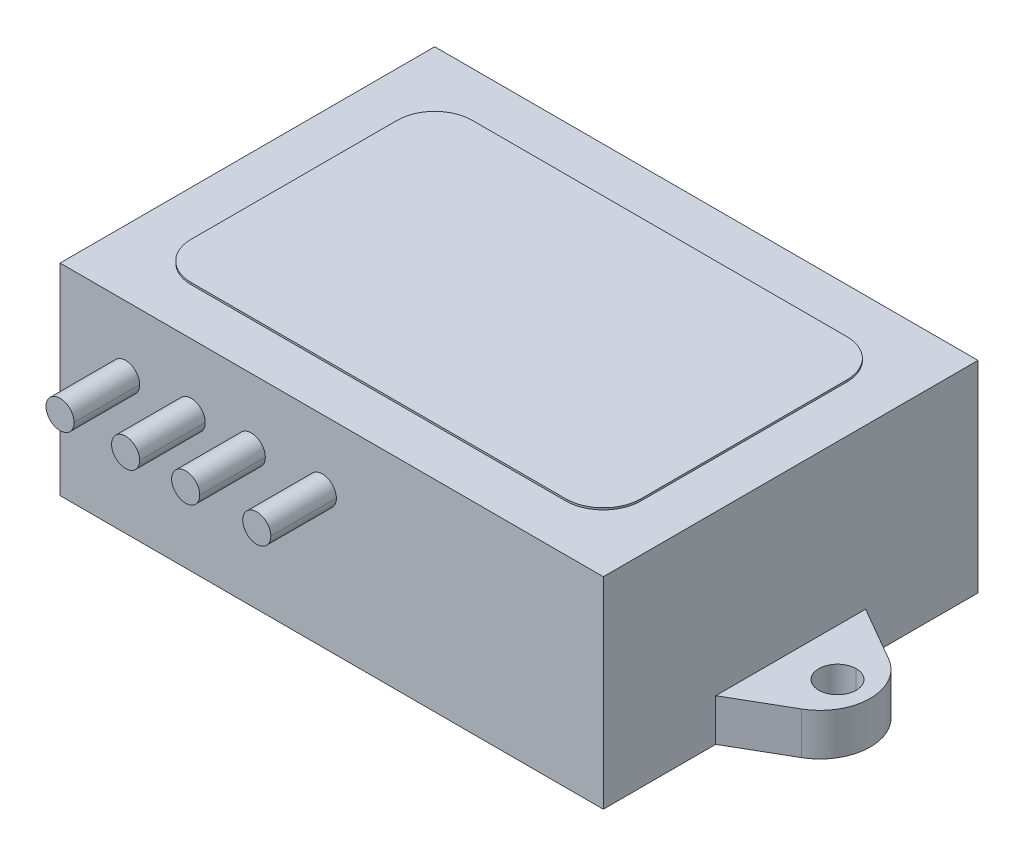
ISO-10303-21;
HEADER;
FILE_DESCRIPTION(('STEP AP214'),'2;1');
FILE_NAME('part.step','',(''),(''),'','','');
FILE_SCHEMA(('AUTOMOTIVE_DESIGN { 1 0 10303 214 1 1 1 1 }'));
ENDSEC;
DATA;
#1=APPLICATION_CONTEXT('core data for automotive mechanical design processes');
#2=APPLICATION_PROTOCOL_DEFINITION('international standard','automotive_design',2000,#1);
#3=PRODUCT_CONTEXT('',#1,'mechanical');
#4=PRODUCT('Part','Part','',(#3));
#5=PRODUCT_RELATED_PRODUCT_CATEGORY('part','',(#4));
#6=PRODUCT_DEFINITION_FORMATION('','',#4);
#7=PRODUCT_DEFINITION_CONTEXT('part definition',#1,'design');
#8=PRODUCT_DEFINITION('design','',#6,#7);
#9=PRODUCT_DEFINITION_SHAPE('','',#8);
#10=(LENGTH_UNIT() NAMED_UNIT(*) SI_UNIT(.MILLI.,.METRE.));
#11=(NAMED_UNIT(*) PLANE_ANGLE_UNIT() SI_UNIT($,.RADIAN.));
#12=(NAMED_UNIT(*) SI_UNIT($,.STERADIAN.) SOLID_ANGLE_UNIT());
#13=UNCERTAINTY_MEASURE_WITH_UNIT(LENGTH_MEASURE(1.E-05),#10,'distance_accuracy_value','');
#14=(GEOMETRIC_REPRESENTATION_CONTEXT(3) GLOBAL_UNCERTAINTY_ASSIGNED_CONTEXT((#13)) GLOBAL_UNIT_ASSIGNED_CONTEXT((#10,
#11,#12)) REPRESENTATION_CONTEXT('',''));
#15=CARTESIAN_POINT('',(0.,0.,0.));
#16=DIRECTION('',(0.,0.,1.));
#17=DIRECTION('',(1.,0.,0.));
#18=AXIS2_PLACEMENT_3D('',#15,#16,#17);
#19=CARTESIAN_POINT('',(20.4126967231264,14.5,7.));
#20=DIRECTION('',(0.,0.,1.));
#21=DIRECTION('',(1.,0.,0.));
#22=AXIS2_PLACEMENT_3D('',#19,#20,#21);
#23=PLANE('',#22);
#24=CARTESIAN_POINT('',(20.4126967231264,14.5,7.));
#25=DIRECTION('',(0.,0.,1.));
#26=DIRECTION('',(1.,0.,0.));
#27=AXIS2_PLACEMENT_3D('',#24,#25,#26);
#28=CIRCLE('',#27,1.5);
#29=CARTESIAN_POINT('',(18.9126967231264,14.5,7.));
#30=VERTEX_POINT('',#29);
#31=CARTESIAN_POINT('',(21.9126967231264,14.5,7.));
#32=VERTEX_POINT('',#31);
#33=EDGE_CURVE('E11',#30,#32,#28,.T.);
#34=ORIENTED_EDGE('',*,*,#33,.T.);
#35=CARTESIAN_POINT('',(20.4126967231264,14.5,7.));
#36=DIRECTION('',(0.,0.,1.));
#37=DIRECTION('',(1.,0.,0.));
#38=AXIS2_PLACEMENT_3D('',#35,#36,#37);
#39=CIRCLE('',#38,1.5);
#40=EDGE_CURVE('E671',#32,#30,#39,.T.);
#41=ORIENTED_EDGE('',*,*,#40,.T.);
#42=EDGE_LOOP('',(#34,#41));
#43=FACE_BOUND('',#42,.T.);
#44=ADVANCED_FACE('F16',(#43),#23,.T.);
#45=CARTESIAN_POINT('',(20.4126967231264,14.5,7.));
#46=DIRECTION('',(0.,0.,-1.));
#47=DIRECTION('',(-1.,0.,0.));
#48=AXIS2_PLACEMENT_3D('',#45,#46,#47);
#49=CYLINDRICAL_SURFACE('',#48,1.5);
#50=DIRECTION('',(0.,0.,-1.));
#51=VECTOR('',#50,1.);
#52=CARTESIAN_POINT('',(21.9126967231264,14.5,7.));
#53=LINE('',#52,#51);
#54=CARTESIAN_POINT('',(21.9126967231264,14.5,0.));
#55=VERTEX_POINT('',#54);
#56=EDGE_CURVE('E674',#32,#55,#53,.T.);
#57=ORIENTED_EDGE('',*,*,#56,.F.);
#58=ORIENTED_EDGE('',*,*,#33,.F.);
#59=DIRECTION('',(0.,0.,-1.));
#60=VECTOR('',#59,1.);
#61=CARTESIAN_POINT('',(18.9126967231264,14.5,7.));
#62=LINE('',#61,#60);
#63=CARTESIAN_POINT('',(18.9126967231264,14.5,0.));
#64=VERTEX_POINT('',#63);
#65=EDGE_CURVE('E344',#30,#64,#62,.T.);
#66=ORIENTED_EDGE('',*,*,#65,.T.);
#67=CARTESIAN_POINT('',(20.4126967231264,14.5,0.));
#68=DIRECTION('',(0.,0.,1.));
#69=DIRECTION('',(-1.,0.,0.));
#70=AXIS2_PLACEMENT_3D('',#67,#68,#69);
#71=CIRCLE('',#70,1.5);
#72=EDGE_CURVE('E435',#64,#55,#71,.T.);
#73=ORIENTED_EDGE('',*,*,#72,.T.);
#74=EDGE_LOOP('',(#57,#58,#66,#73));
#75=FACE_BOUND('',#74,.T.);
#76=ADVANCED_FACE('F662',(#75),#49,.T.);
#77=CARTESIAN_POINT('',(14.,14.5,7.));
#78=DIRECTION('',(0.,0.,1.));
#79=DIRECTION('',(1.,0.,0.));
#80=AXIS2_PLACEMENT_3D('',#77,#78,#79);
#81=PLANE('',#80);
#82=CARTESIAN_POINT('',(14.,14.5,7.));
#83=DIRECTION('',(0.,0.,1.));
#84=DIRECTION('',(1.,0.,0.));
#85=AXIS2_PLACEMENT_3D('',#82,#83,#84);
#86=CIRCLE('',#85,1.5);
#87=CARTESIAN_POINT('',(12.5,14.5,7.));
#88=VERTEX_POINT('',#87);
#89=CARTESIAN_POINT('',(15.5,14.5,7.));
#90=VERTEX_POINT('',#89);
#91=EDGE_CURVE('E19',#88,#90,#86,.T.);
#92=ORIENTED_EDGE('',*,*,#91,.T.);
#93=CARTESIAN_POINT('',(14.,14.5,7.));
#94=DIRECTION('',(0.,0.,1.));
#95=DIRECTION('',(1.,0.,0.));
#96=AXIS2_PLACEMENT_3D('',#93,#94,#95);
#97=CIRCLE('',#96,1.5);
#98=EDGE_CURVE('E340',#90,#88,#97,.T.);
#99=ORIENTED_EDGE('',*,*,#98,.T.);
#100=EDGE_LOOP('',(#92,#99));
#101=FACE_BOUND('',#100,.T.);
#102=ADVANCED_FACE('F666',(#101),#81,.T.);
#103=CARTESIAN_POINT('',(14.,14.5,7.));
#104=DIRECTION('',(0.,0.,-1.));
#105=DIRECTION('',(-1.,0.,0.));
#106=AXIS2_PLACEMENT_3D('',#103,#104,#105);
#107=CYLINDRICAL_SURFACE('',#106,1.5);
#108=DIRECTION('',(0.,0.,-1.));
#109=VECTOR('',#108,1.);
#110=CARTESIAN_POINT('',(15.5,14.5,7.));
#111=LINE('',#110,#109);
#112=CARTESIAN_POINT('',(15.5,14.5,0.));
#113=VERTEX_POINT('',#112);
#114=EDGE_CURVE('E342',#90,#113,#111,.T.);
#115=ORIENTED_EDGE('',*,*,#114,.F.);
#116=ORIENTED_EDGE('',*,*,#91,.F.);
#117=DIRECTION('',(0.,0.,-1.));
#118=VECTOR('',#117,1.);
#119=CARTESIAN_POINT('',(12.5,14.5,7.));
#120=LINE('',#119,#118);
#121=CARTESIAN_POINT('',(12.5,14.5,0.));
#122=VERTEX_POINT('',#121);
#123=EDGE_CURVE('E360',#88,#122,#120,.T.);
#124=ORIENTED_EDGE('',*,*,#123,.T.);
#125=CARTESIAN_POINT('',(14.,14.5,0.));
#126=DIRECTION('',(0.,0.,1.));
#127=DIRECTION('',(-1.,0.,0.));
#128=AXIS2_PLACEMENT_3D('',#125,#126,#127);
#129=CIRCLE('',#128,1.5);
#130=EDGE_CURVE('E306',#122,#113,#129,.T.);
#131=ORIENTED_EDGE('',*,*,#130,.T.);
#132=EDGE_LOOP('',(#115,#116,#124,#131));
#133=FACE_BOUND('',#132,.T.);
#134=ADVANCED_FACE('F1489',(#133),#107,.T.);
#135=CARTESIAN_POINT('',(28.,14.5,7.));
#136=DIRECTION('',(0.,0.,1.));
#137=DIRECTION('',(1.,0.,0.));
#138=AXIS2_PLACEMENT_3D('',#135,#136,#137);
#139=PLANE('',#138);
#140=CARTESIAN_POINT('',(28.,14.5,7.));
#141=DIRECTION('',(0.,0.,1.));
#142=DIRECTION('',(1.,0.,0.));
#143=AXIS2_PLACEMENT_3D('',#140,#141,#142);
#144=CIRCLE('',#143,1.5);
#145=CARTESIAN_POINT('',(26.5,14.5,7.));
#146=VERTEX_POINT('',#145);
#147=CARTESIAN_POINT('',(29.5,14.5,7.));
#148=VERTEX_POINT('',#147);
#149=EDGE_CURVE('E311',#146,#148,#144,.T.);
#150=ORIENTED_EDGE('',*,*,#149,.T.);
#151=CARTESIAN_POINT('',(28.,14.5,7.));
#152=DIRECTION('',(0.,0.,1.));
#153=DIRECTION('',(1.,0.,0.));
#154=AXIS2_PLACEMENT_3D('',#151,#152,#153);
#155=CIRCLE('',#154,1.5);
#156=EDGE_CURVE('E327',#148,#146,#155,.T.);
#157=ORIENTED_EDGE('',*,*,#156,.T.);
#158=EDGE_LOOP('',(#150,#157));
#159=FACE_BOUND('',#158,.T.);
#160=ADVANCED_FACE('F1478',(#159),#139,.T.);
#161=CARTESIAN_POINT('',(28.,14.5,7.));
#162=DIRECTION('',(0.,0.,-1.));
#163=DIRECTION('',(-1.,0.,0.));
#164=AXIS2_PLACEMENT_3D('',#161,#162,#163);
#165=CYLINDRICAL_SURFACE('',#164,1.5);
#166=DIRECTION('',(0.,0.,-1.));
#167=VECTOR('',#166,1.);
#168=CARTESIAN_POINT('',(29.5,14.5,7.));
#169=LINE('',#168,#167);
#170=CARTESIAN_POINT('',(29.5,14.5,0.));
#171=VERTEX_POINT('',#170);
#172=EDGE_CURVE('E321',#148,#171,#169,.T.);
#173=ORIENTED_EDGE('',*,*,#172,.F.);
#174=ORIENTED_EDGE('',*,*,#149,.F.);
#175=DIRECTION('',(0.,0.,-1.));
#176=VECTOR('',#175,1.);
#177=CARTESIAN_POINT('',(26.5,14.5,7.));
#178=LINE('',#177,#176);
#179=CARTESIAN_POINT('',(26.5,14.5,0.));
#180=VERTEX_POINT('',#179);
#181=EDGE_CURVE('E313',#146,#180,#178,.T.);
#182=ORIENTED_EDGE('',*,*,#181,.T.);
#183=CARTESIAN_POINT('',(28.,14.5,0.));
#184=DIRECTION('',(0.,0.,1.));
#185=DIRECTION('',(-1.,0.,0.));
#186=AXIS2_PLACEMENT_3D('',#183,#184,#185);
#187=CIRCLE('',#186,1.5);
#188=EDGE_CURVE('E300',#180,#171,#187,.T.);
#189=ORIENTED_EDGE('',*,*,#188,.T.);
#190=EDGE_LOOP('',(#173,#174,#182,#189));
#191=FACE_BOUND('',#190,.T.);
#192=ADVANCED_FACE('F315',(#191),#165,.T.);
#193=CARTESIAN_POINT('',(7.,14.5,7.));
#194=DIRECTION('',(0.,0.,1.));
#195=DIRECTION('',(1.,0.,0.));
#196=AXIS2_PLACEMENT_3D('',#193,#194,#195);
#197=PLANE('',#196);
#198=CARTESIAN_POINT('',(7.,14.5,7.));
#199=DIRECTION('',(0.,0.,1.));
#200=DIRECTION('',(1.,0.,0.));
#201=AXIS2_PLACEMENT_3D('',#198,#199,#200);
#202=CIRCLE('',#201,1.5);
#203=CARTESIAN_POINT('',(5.5,14.5,7.));
#204=VERTEX_POINT('',#203);
#205=CARTESIAN_POINT('',(8.5,14.5,7.));
#206=VERTEX_POINT('',#205);
#207=EDGE_CURVE('E496',#204,#206,#202,.T.);
#208=ORIENTED_EDGE('',*,*,#207,.T.);
#209=CARTESIAN_POINT('',(7.,14.5,7.));
#210=DIRECTION('',(0.,0.,1.));
#211=DIRECTION('',(1.,0.,0.));
#212=AXIS2_PLACEMENT_3D('',#209,#210,#211);
#213=CIRCLE('',#212,1.5);
#214=EDGE_CURVE('E318',#206,#204,#213,.T.);
#215=ORIENTED_EDGE('',*,*,#214,.T.);
#216=EDGE_LOOP('',(#208,#215));
#217=FACE_BOUND('',#216,.T.);
#218=ADVANCED_FACE('F1327',(#217),#197,.T.);
#219=CARTESIAN_POINT('',(7.,14.5,7.));
#220=DIRECTION('',(0.,0.,-1.));
#221=DIRECTION('',(-1.,0.,0.));
#222=AXIS2_PLACEMENT_3D('',#219,#220,#221);
#223=CYLINDRICAL_SURFACE('',#222,1.5);
#224=DIRECTION('',(0.,0.,-1.));
#225=VECTOR('',#224,1.);
#226=CARTESIAN_POINT('',(8.5,14.5,7.));
#227=LINE('',#226,#225);
#228=CARTESIAN_POINT('',(8.5,14.5,0.));
#229=VERTEX_POINT('',#228);
#230=EDGE_CURVE('E347',#206,#229,#227,.T.);
#231=ORIENTED_EDGE('',*,*,#230,.F.);
#232=ORIENTED_EDGE('',*,*,#207,.F.);
#233=DIRECTION('',(0.,0.,-1.));
#234=VECTOR('',#233,1.);
#235=CARTESIAN_POINT('',(5.5,14.5,7.));
#236=LINE('',#235,#234);
#237=CARTESIAN_POINT('',(5.5,14.5,0.));
#238=VERTEX_POINT('',#237);
#239=EDGE_CURVE('E371',#204,#238,#236,.T.);
#240=ORIENTED_EDGE('',*,*,#239,.T.);
#241=CARTESIAN_POINT('',(7.,14.5,0.));
#242=DIRECTION('',(0.,0.,1.));
#243=DIRECTION('',(1.,0.,0.));
#244=AXIS2_PLACEMENT_3D('',#241,#242,#243);
#245=CIRCLE('',#244,1.5);
#246=EDGE_CURVE('E307',#238,#229,#245,.T.);
#247=ORIENTED_EDGE('',*,*,#246,.T.);
#248=EDGE_LOOP('',(#231,#232,#240,#247));
#249=FACE_BOUND('',#248,.T.);
#250=ADVANCED_FACE('F761',(#249),#223,.T.);
#251=CARTESIAN_POINT('',(9.,21.7,-9.));
#252=DIRECTION('',(0.,1.,0.));
#253=DIRECTION('',(1.,0.,0.));
#254=AXIS2_PLACEMENT_3D('',#251,#252,#253);
#255=PLANE('',#254);
#256=CARTESIAN_POINT('',(9.,21.7,-9.));
#257=DIRECTION('',(0.,1.,0.));
#258=DIRECTION('',(0.,0.,1.));
#259=AXIS2_PLACEMENT_3D('',#256,#257,#258);
#260=CIRCLE('',#259,4.);
#261=CARTESIAN_POINT('',(5.,21.7,-9.));
#262=VERTEX_POINT('',#261);
#263=CARTESIAN_POINT('',(9.,21.7,-5.));
#264=VERTEX_POINT('',#263);
#265=EDGE_CURVE('E530',#262,#264,#260,.T.);
#266=ORIENTED_EDGE('',*,*,#265,.T.);
#267=DIRECTION('',(1.,0.,0.));
#268=VECTOR('',#267,1.);
#269=CARTESIAN_POINT('',(9.,21.7,-5.));
#270=LINE('',#269,#268);
#271=CARTESIAN_POINT('',(49.,21.7,-5.));
#272=VERTEX_POINT('',#271);
#273=EDGE_CURVE('E456',#264,#272,#270,.T.);
#274=ORIENTED_EDGE('',*,*,#273,.T.);
#275=CARTESIAN_POINT('',(49.,21.7,-9.));
#276=DIRECTION('',(0.,1.,0.));
#277=DIRECTION('',(0.,0.,1.));
#278=AXIS2_PLACEMENT_3D('',#275,#276,#277);
#279=CIRCLE('',#278,4.);
#280=CARTESIAN_POINT('',(53.,21.7,-9.));
#281=VERTEX_POINT('',#280);
#282=EDGE_CURVE('E598',#272,#281,#279,.T.);
#283=ORIENTED_EDGE('',*,*,#282,.T.);
#284=DIRECTION('',(0.,0.,-1.));
#285=VECTOR('',#284,1.);
#286=CARTESIAN_POINT('',(53.,21.7,-9.));
#287=LINE('',#286,#285);
#288=CARTESIAN_POINT('',(53.,21.7,-31.));
#289=VERTEX_POINT('',#288);
#290=EDGE_CURVE('E604',#281,#289,#287,.T.);
#291=ORIENTED_EDGE('',*,*,#290,.T.);
#292=CARTESIAN_POINT('',(49.,21.7,-31.));
#293=DIRECTION('',(0.,1.,0.));
#294=DIRECTION('',(0.,0.,1.));
#295=AXIS2_PLACEMENT_3D('',#292,#293,#294);
#296=CIRCLE('',#295,4.);
#297=CARTESIAN_POINT('',(49.,21.7,-35.));
#298=VERTEX_POINT('',#297);
#299=EDGE_CURVE('E331',#289,#298,#296,.T.);
#300=ORIENTED_EDGE('',*,*,#299,.T.);
#301=DIRECTION('',(-1.,0.,0.));
#302=VECTOR('',#301,1.);
#303=CARTESIAN_POINT('',(49.,21.7,-35.));
#304=LINE('',#303,#302);
#305=CARTESIAN_POINT('',(9.,21.7,-35.));
#306=VERTEX_POINT('',#305);
#307=EDGE_CURVE('E608',#298,#306,#304,.T.);
#308=ORIENTED_EDGE('',*,*,#307,.T.);
#309=CARTESIAN_POINT('',(9.,21.7,-31.));
#310=DIRECTION('',(0.,1.,0.));
#311=DIRECTION('',(0.,0.,-1.));
#312=AXIS2_PLACEMENT_3D('',#309,#310,#311);
#313=CIRCLE('',#312,4.);
#314=CARTESIAN_POINT('',(5.,21.7,-31.));
#315=VERTEX_POINT('',#314);
#316=EDGE_CURVE('E48',#306,#315,#313,.T.);
#317=ORIENTED_EDGE('',*,*,#316,.T.);
#318=DIRECTION('',(0.,0.,1.));
#319=VECTOR('',#318,1.);
#320=CARTESIAN_POINT('',(5.,21.7,-31.));
#321=LINE('',#320,#319);
#322=EDGE_CURVE('E36',#315,#262,#321,.T.);
#323=ORIENTED_EDGE('',*,*,#322,.T.);
#324=EDGE_LOOP('',(#266,#274,#283,#291,#300,#308,#317,#323));
#325=FACE_BOUND('',#324,.T.);
#326=ADVANCED_FACE('F635',(#325),#255,.T.);
#327=CARTESIAN_POINT('',(5.,21.7,-31.));
#328=DIRECTION('',(1.,0.,0.));
#329=DIRECTION('',(0.,1.,0.));
#330=AXIS2_PLACEMENT_3D('',#327,#328,#329);
#331=PLANE('',#330);
#332=DIRECTION('',(0.,0.,1.));
#333=VECTOR('',#332,1.);
#334=CARTESIAN_POINT('',(5.,21.5,-31.));
#335=LINE('',#334,#333);
#336=CARTESIAN_POINT('',(5.,21.5,-31.));
#337=VERTEX_POINT('',#336);
#338=CARTESIAN_POINT('',(5.,21.5,-9.));
#339=VERTEX_POINT('',#338);
#340=EDGE_CURVE('E442',#337,#339,#335,.T.);
#341=ORIENTED_EDGE('',*,*,#340,.T.);
#342=DIRECTION('',(0.,-1.,0.));
#343=VECTOR('',#342,1.);
#344=CARTESIAN_POINT('',(5.,21.7,-9.));
#345=LINE('',#344,#343);
#346=EDGE_CURVE('E589',#262,#339,#345,.T.);
#347=ORIENTED_EDGE('',*,*,#346,.F.);
#348=ORIENTED_EDGE('',*,*,#322,.F.);
#349=DIRECTION('',(0.,-1.,0.));
#350=VECTOR('',#349,1.);
#351=CARTESIAN_POINT('',(5.,21.7,-31.));
#352=LINE('',#351,#350);
#353=EDGE_CURVE('E538',#315,#337,#352,.T.);
#354=ORIENTED_EDGE('',*,*,#353,.T.);
#355=EDGE_LOOP('',(#341,#347,#348,#354));
#356=FACE_BOUND('',#355,.T.);
#357=ADVANCED_FACE('F615',(#356),#331,.F.);
#358=CARTESIAN_POINT('',(9.,21.7,-31.));
#359=DIRECTION('',(0.,-1.,0.));
#360=DIRECTION('',(0.,0.,-1.));
#361=AXIS2_PLACEMENT_3D('',#358,#359,#360);
#362=CYLINDRICAL_SURFACE('',#361,4.);
#363=CARTESIAN_POINT('',(9.,21.5,-31.));
#364=DIRECTION('',(0.,1.,0.));
#365=DIRECTION('',(0.,0.,-1.));
#366=AXIS2_PLACEMENT_3D('',#363,#364,#365);
#367=CIRCLE('',#366,4.);
#368=CARTESIAN_POINT('',(9.,21.5,-35.));
#369=VERTEX_POINT('',#368);
#370=EDGE_CURVE('E443',#369,#337,#367,.T.);
#371=ORIENTED_EDGE('',*,*,#370,.T.);
#372=ORIENTED_EDGE('',*,*,#353,.F.);
#373=ORIENTED_EDGE('',*,*,#316,.F.);
#374=DIRECTION('',(0.,-1.,0.));
#375=VECTOR('',#374,1.);
#376=CARTESIAN_POINT('',(9.,21.7,-35.));
#377=LINE('',#376,#375);
#378=EDGE_CURVE('E339',#306,#369,#377,.T.);
#379=ORIENTED_EDGE('',*,*,#378,.T.);
#380=EDGE_LOOP('',(#371,#372,#373,#379));
#381=FACE_BOUND('',#380,.T.);
#382=ADVANCED_FACE('F617',(#381),#362,.T.);
#383=CARTESIAN_POINT('',(49.,21.7,-35.));
#384=DIRECTION('',(0.,0.,1.));
#385=DIRECTION('',(1.,0.,0.));
#386=AXIS2_PLACEMENT_3D('',#383,#384,#385);
#387=PLANE('',#386);
#388=DIRECTION('',(-1.,0.,0.));
#389=VECTOR('',#388,1.);
#390=CARTESIAN_POINT('',(49.,21.5,-35.));
#391=LINE('',#390,#389);
#392=CARTESIAN_POINT('',(49.,21.5,-35.));
#393=VERTEX_POINT('',#392);
#394=EDGE_CURVE('E448',#393,#369,#391,.T.);
#395=ORIENTED_EDGE('',*,*,#394,.T.);
#396=ORIENTED_EDGE('',*,*,#378,.F.);
#397=ORIENTED_EDGE('',*,*,#307,.F.);
#398=DIRECTION('',(0.,-1.,0.));
#399=VECTOR('',#398,1.);
#400=CARTESIAN_POINT('',(49.,21.7,-35.));
#401=LINE('',#400,#399);
#402=EDGE_CURVE('E338',#298,#393,#401,.T.);
#403=ORIENTED_EDGE('',*,*,#402,.T.);
#404=EDGE_LOOP('',(#395,#396,#397,#403));
#405=FACE_BOUND('',#404,.T.);
#406=ADVANCED_FACE('F637',(#405),#387,.F.);
#407=CARTESIAN_POINT('',(49.,21.7,-31.));
#408=DIRECTION('',(0.,-1.,0.));
#409=DIRECTION('',(0.,0.,-1.));
#410=AXIS2_PLACEMENT_3D('',#407,#408,#409);
#411=CYLINDRICAL_SURFACE('',#410,4.);
#412=CARTESIAN_POINT('',(49.,21.5,-31.));
#413=DIRECTION('',(0.,1.,0.));
#414=DIRECTION('',(0.,0.,1.));
#415=AXIS2_PLACEMENT_3D('',#412,#413,#414);
#416=CIRCLE('',#415,4.);
#417=CARTESIAN_POINT('',(53.,21.5,-31.));
#418=VERTEX_POINT('',#417);
#419=EDGE_CURVE('E453',#418,#393,#416,.T.);
#420=ORIENTED_EDGE('',*,*,#419,.T.);
#421=ORIENTED_EDGE('',*,*,#402,.F.);
#422=ORIENTED_EDGE('',*,*,#299,.F.);
#423=DIRECTION('',(0.,-1.,0.));
#424=VECTOR('',#423,1.);
#425=CARTESIAN_POINT('',(53.,21.7,-31.));
#426=LINE('',#425,#424);
#427=EDGE_CURVE('E605',#289,#418,#426,.T.);
#428=ORIENTED_EDGE('',*,*,#427,.T.);
#429=EDGE_LOOP('',(#420,#421,#422,#428));
#430=FACE_BOUND('',#429,.T.);
#431=ADVANCED_FACE('F643',(#430),#411,.T.);
#432=CARTESIAN_POINT('',(53.,21.7,-9.));
#433=DIRECTION('',(-1.,0.,0.));
#434=DIRECTION('',(0.,0.,1.));
#435=AXIS2_PLACEMENT_3D('',#432,#433,#434);
#436=PLANE('',#435);
#437=DIRECTION('',(0.,0.,-1.));
#438=VECTOR('',#437,1.);
#439=CARTESIAN_POINT('',(53.,21.5,-9.));
#440=LINE('',#439,#438);
#441=CARTESIAN_POINT('',(53.,21.5,-9.));
#442=VERTEX_POINT('',#441);
#443=EDGE_CURVE('E381',#442,#418,#440,.T.);
#444=ORIENTED_EDGE('',*,*,#443,.T.);
#445=ORIENTED_EDGE('',*,*,#427,.F.);
#446=ORIENTED_EDGE('',*,*,#290,.F.);
#447=DIRECTION('',(0.,-1.,0.));
#448=VECTOR('',#447,1.);
#449=CARTESIAN_POINT('',(53.,21.7,-9.));
#450=LINE('',#449,#448);
#451=EDGE_CURVE('E461',#281,#442,#450,.T.);
#452=ORIENTED_EDGE('',*,*,#451,.T.);
#453=EDGE_LOOP('',(#444,#445,#446,#452));
#454=FACE_BOUND('',#453,.T.);
#455=ADVANCED_FACE('F644',(#454),#436,.F.);
#456=CARTESIAN_POINT('',(49.,21.7,-9.));
#457=DIRECTION('',(0.,-1.,0.));
#458=DIRECTION('',(0.,0.,-1.));
#459=AXIS2_PLACEMENT_3D('',#456,#457,#458);
#460=CYLINDRICAL_SURFACE('',#459,4.);
#461=CARTESIAN_POINT('',(49.,21.5,-9.));
#462=DIRECTION('',(0.,1.,0.));
#463=DIRECTION('',(0.,0.,1.));
#464=AXIS2_PLACEMENT_3D('',#461,#462,#463);
#465=CIRCLE('',#464,4.);
#466=CARTESIAN_POINT('',(49.,21.5,-5.));
#467=VERTEX_POINT('',#466);
#468=EDGE_CURVE('E376',#467,#442,#465,.T.);
#469=ORIENTED_EDGE('',*,*,#468,.T.);
#470=ORIENTED_EDGE('',*,*,#451,.F.);
#471=ORIENTED_EDGE('',*,*,#282,.F.);
#472=DIRECTION('',(0.,-1.,0.));
#473=VECTOR('',#472,1.);
#474=CARTESIAN_POINT('',(49.,21.7,-5.));
#475=LINE('',#474,#473);
#476=EDGE_CURVE('E465',#272,#467,#475,.T.);
#477=ORIENTED_EDGE('',*,*,#476,.T.);
#478=EDGE_LOOP('',(#469,#470,#471,#477));
#479=FACE_BOUND('',#478,.T.);
#480=ADVANCED_FACE('F650',(#479),#460,.T.);
#481=CARTESIAN_POINT('',(9.,21.7,-5.));
#482=DIRECTION('',(0.,0.,-1.));
#483=DIRECTION('',(0.,-1.,0.));
#484=AXIS2_PLACEMENT_3D('',#481,#482,#483);
#485=PLANE('',#484);
#486=DIRECTION('',(1.,0.,0.));
#487=VECTOR('',#486,1.);
#488=CARTESIAN_POINT('',(9.,21.5,-5.));
#489=LINE('',#488,#487);
#490=CARTESIAN_POINT('',(9.,21.5,-5.));
#491=VERTEX_POINT('',#490);
#492=EDGE_CURVE('E379',#491,#467,#489,.T.);
#493=ORIENTED_EDGE('',*,*,#492,.T.);
#494=ORIENTED_EDGE('',*,*,#476,.F.);
#495=ORIENTED_EDGE('',*,*,#273,.F.);
#496=DIRECTION('',(0.,-1.,0.));
#497=VECTOR('',#496,1.);
#498=CARTESIAN_POINT('',(9.,21.7,-5.));
#499=LINE('',#498,#497);
#500=EDGE_CURVE('E413',#264,#491,#499,.T.);
#501=ORIENTED_EDGE('',*,*,#500,.T.);
#502=EDGE_LOOP('',(#493,#494,#495,#501));
#503=FACE_BOUND('',#502,.T.);
#504=ADVANCED_FACE('F647',(#503),#485,.F.);
#505=CARTESIAN_POINT('',(9.,21.7,-9.));
#506=DIRECTION('',(0.,-1.,0.));
#507=DIRECTION('',(0.,0.,-1.));
#508=AXIS2_PLACEMENT_3D('',#505,#506,#507);
#509=CYLINDRICAL_SURFACE('',#508,4.);
#510=CARTESIAN_POINT('',(9.,21.5,-9.));
#511=DIRECTION('',(0.,1.,0.));
#512=DIRECTION('',(0.,0.,1.));
#513=AXIS2_PLACEMENT_3D('',#510,#511,#512);
#514=CIRCLE('',#513,4.);
#515=EDGE_CURVE('E440',#339,#491,#514,.T.);
#516=ORIENTED_EDGE('',*,*,#515,.T.);
#517=ORIENTED_EDGE('',*,*,#500,.F.);
#518=ORIENTED_EDGE('',*,*,#265,.F.);
#519=ORIENTED_EDGE('',*,*,#346,.T.);
#520=EDGE_LOOP('',(#516,#517,#518,#519));
#521=FACE_BOUND('',#520,.T.);
#522=ADVANCED_FACE('F628',(#521),#509,.T.);
#523=CARTESIAN_POINT('',(63.,0.,-20.));
#524=DIRECTION('',(0.,1.,0.));
#525=DIRECTION('',(0.,0.,1.));
#526=AXIS2_PLACEMENT_3D('',#523,#524,#525);
#527=CYLINDRICAL_SURFACE('',#526,2.);
#528=DIRECTION('',(0.,1.,0.));
#529=VECTOR('',#528,1.);
#530=CARTESIAN_POINT('',(63.,0.,-22.));
#531=LINE('',#530,#529);
#532=CARTESIAN_POINT('',(63.,0.,-22.));
#533=VERTEX_POINT('',#532);
#534=CARTESIAN_POINT('',(63.,4.5,-22.));
#535=VERTEX_POINT('',#534);
#536=EDGE_CURVE('E367',#533,#535,#531,.T.);
#537=ORIENTED_EDGE('',*,*,#536,.F.);
#538=CARTESIAN_POINT('',(63.,0.,-20.));
#539=DIRECTION('',(0.,1.,0.));
#540=DIRECTION('',(0.,0.,-1.));
#541=AXIS2_PLACEMENT_3D('',#538,#539,#540);
#542=CIRCLE('',#541,2.);
#543=CARTESIAN_POINT('',(63.,0.,-18.));
#544=VERTEX_POINT('',#543);
#545=EDGE_CURVE('E335',#544,#533,#542,.T.);
#546=ORIENTED_EDGE('',*,*,#545,.F.);
#547=DIRECTION('',(0.,1.,0.));
#548=VECTOR('',#547,1.);
#549=CARTESIAN_POINT('',(63.,0.,-18.));
#550=LINE('',#549,#548);
#551=CARTESIAN_POINT('',(63.,4.5,-18.));
#552=VERTEX_POINT('',#551);
#553=EDGE_CURVE('E391',#544,#552,#550,.T.);
#554=ORIENTED_EDGE('',*,*,#553,.T.);
#555=CARTESIAN_POINT('',(63.,4.5,-20.));
#556=DIRECTION('',(0.,1.,0.));
#557=DIRECTION('',(0.,0.,-1.));
#558=AXIS2_PLACEMENT_3D('',#555,#556,#557);
#559=CIRCLE('',#558,2.);
#560=EDGE_CURVE('E419',#552,#535,#559,.T.);
#561=ORIENTED_EDGE('',*,*,#560,.T.);
#562=EDGE_LOOP('',(#537,#546,#554,#561));
#563=FACE_BOUND('',#562,.T.);
#564=ADVANCED_FACE('F660',(#563),#527,.F.);
#565=CARTESIAN_POINT('',(-5.,0.,-20.));
#566=DIRECTION('',(0.,1.,0.));
#567=DIRECTION('',(0.,0.,1.));
#568=AXIS2_PLACEMENT_3D('',#565,#566,#567);
#569=CYLINDRICAL_SURFACE('',#568,2.);
#570=DIRECTION('',(0.,1.,0.));
#571=VECTOR('',#570,1.);
#572=CARTESIAN_POINT('',(-5.,0.,-22.));
#573=LINE('',#572,#571);
#574=CARTESIAN_POINT('',(-5.,0.,-22.));
#575=VERTEX_POINT('',#574);
#576=CARTESIAN_POINT('',(-5.,4.5,-22.));
#577=VERTEX_POINT('',#576);
#578=EDGE_CURVE('E362',#575,#577,#573,.T.);
#579=ORIENTED_EDGE('',*,*,#578,.F.);
#580=CARTESIAN_POINT('',(-5.,0.,-20.));
#581=DIRECTION('',(0.,1.,0.));
#582=DIRECTION('',(0.,0.,1.));
#583=AXIS2_PLACEMENT_3D('',#580,#581,#582);
#584=CIRCLE('',#583,2.);
#585=CARTESIAN_POINT('',(-5.,0.,-18.));
#586=VERTEX_POINT('',#585);
#587=EDGE_CURVE('E410',#586,#575,#584,.T.);
#588=ORIENTED_EDGE('',*,*,#587,.F.);
#589=DIRECTION('',(0.,1.,0.));
#590=VECTOR('',#589,1.);
#591=CARTESIAN_POINT('',(-5.,0.,-18.));
#592=LINE('',#591,#590);
#593=CARTESIAN_POINT('',(-5.,4.5,-18.));
#594=VERTEX_POINT('',#593);
#595=EDGE_CURVE('E363',#586,#594,#592,.T.);
#596=ORIENTED_EDGE('',*,*,#595,.T.);
#597=CARTESIAN_POINT('',(-5.,4.5,-20.));
#598=DIRECTION('',(0.,1.,0.));
#599=DIRECTION('',(0.,0.,1.));
#600=AXIS2_PLACEMENT_3D('',#597,#598,#599);
#601=CIRCLE('',#600,2.);
#602=EDGE_CURVE('E415',#594,#577,#601,.T.);
#603=ORIENTED_EDGE('',*,*,#602,.T.);
#604=EDGE_LOOP('',(#579,#588,#596,#603));
#605=FACE_BOUND('',#604,.T.);
#606=ADVANCED_FACE('F746',(#605),#569,.F.);
#607=CARTESIAN_POINT('',(-3.14359353944896,4.5,-20.));
#608=DIRECTION('',(0.,-1.,0.));
#609=DIRECTION('',(0.,0.,-1.));
#610=AXIS2_PLACEMENT_3D('',#607,#608,#609);
#611=PLANE('',#610);
#612=ORIENTED_EDGE('',*,*,#602,.F.);
#613=CARTESIAN_POINT('',(-5.,4.5,-20.));
#614=DIRECTION('',(0.,1.,0.));
#615=DIRECTION('',(0.,0.,1.));
#616=AXIS2_PLACEMENT_3D('',#613,#614,#615);
#617=CIRCLE('',#616,2.);
#618=EDGE_CURVE('E359',#577,#594,#617,.T.);
#619=ORIENTED_EDGE('',*,*,#618,.F.);
#620=EDGE_LOOP('',(#612,#619));
#621=FACE_BOUND('',#620,.T.);
#622=DIRECTION('',(-0.866025403784439,0.,0.5));
#623=VECTOR('',#622,1.);
#624=CARTESIAN_POINT('',(0.,4.5,-28.));
#625=LINE('',#624,#623);
#626=CARTESIAN_POINT('',(0.,4.5,-28.));
#627=VERTEX_POINT('',#626);
#628=CARTESIAN_POINT('',(-5.82179676972447,4.5,-24.6387840678323));
#629=VERTEX_POINT('',#628);
#630=EDGE_CURVE('E514',#627,#629,#625,.T.);
#631=ORIENTED_EDGE('',*,*,#630,.T.);
#632=CARTESIAN_POINT('',(-3.14359353944896,4.5,-20.));
#633=DIRECTION('',(0.,1.,0.));
#634=DIRECTION('',(0.,0.,-1.));
#635=AXIS2_PLACEMENT_3D('',#632,#633,#634);
#636=CIRCLE('',#635,5.35640646055104);
#637=CARTESIAN_POINT('',(-5.82179676972447,4.5,-15.3612159321677));
#638=VERTEX_POINT('',#637);
#639=EDGE_CURVE('E547',#629,#638,#636,.T.);
#640=ORIENTED_EDGE('',*,*,#639,.T.);
#641=DIRECTION('',(0.866025403784439,0.,0.5));
#642=VECTOR('',#641,1.);
#643=CARTESIAN_POINT('',(0.,4.5,-12.));
#644=LINE('',#643,#642);
#645=CARTESIAN_POINT('',(0.,4.5,-12.));
#646=VERTEX_POINT('',#645);
#647=EDGE_CURVE('E418',#638,#646,#644,.T.);
#648=ORIENTED_EDGE('',*,*,#647,.T.);
#649=DIRECTION('',(0.,0.,-1.));
#650=VECTOR('',#649,1.);
#651=CARTESIAN_POINT('',(0.,4.5,-28.));
#652=LINE('',#651,#650);
#653=EDGE_CURVE('E471',#646,#627,#652,.T.);
#654=ORIENTED_EDGE('',*,*,#653,.T.);
#655=EDGE_LOOP('',(#631,#640,#648,#654));
#656=FACE_BOUND('',#655,.T.);
#657=ADVANCED_FACE('F748',(#621,#656),#611,.F.);
#658=CARTESIAN_POINT('',(0.,4.5,-12.));
#659=DIRECTION('',(0.5,0.,-0.866025403784439));
#660=DIRECTION('',(0.,-1.,0.));
#661=AXIS2_PLACEMENT_3D('',#658,#659,#660);
#662=PLANE('',#661);
#663=DIRECTION('',(0.866025403784439,0.,0.5));
#664=VECTOR('',#663,1.);
#665=CARTESIAN_POINT('',(0.,0.,-12.));
#666=LINE('',#665,#664);
#667=CARTESIAN_POINT('',(-5.82179676972447,0.,-15.3612159321677));
#668=VERTEX_POINT('',#667);
#669=CARTESIAN_POINT('',(0.,0.,-12.));
#670=VERTEX_POINT('',#669);
#671=EDGE_CURVE('E559',#668,#670,#666,.T.);
#672=ORIENTED_EDGE('',*,*,#671,.T.);
#673=DIRECTION('',(0.,-1.,0.));
#674=VECTOR('',#673,1.);
#675=CARTESIAN_POINT('',(0.,4.5,-12.));
#676=LINE('',#675,#674);
#677=EDGE_CURVE('E480',#646,#670,#676,.T.);
#678=ORIENTED_EDGE('',*,*,#677,.F.);
#679=ORIENTED_EDGE('',*,*,#647,.F.);
#680=DIRECTION('',(0.,-1.,0.));
#681=VECTOR('',#680,1.);
#682=CARTESIAN_POINT('',(-5.82179676972447,4.5,-15.3612159321677));
#683=LINE('',#682,#681);
#684=EDGE_CURVE('E544',#638,#668,#683,.T.);
#685=ORIENTED_EDGE('',*,*,#684,.T.);
#686=EDGE_LOOP('',(#672,#678,#679,#685));
#687=FACE_BOUND('',#686,.T.);
#688=ADVANCED_FACE('F737',(#687),#662,.F.);
#689=CARTESIAN_POINT('',(-3.14359353944896,4.5,-20.));
#690=DIRECTION('',(0.,-1.,0.));
#691=DIRECTION('',(0.,0.,-1.));
#692=AXIS2_PLACEMENT_3D('',#689,#690,#691);
#693=CYLINDRICAL_SURFACE('',#692,5.35640646055104);
#694=CARTESIAN_POINT('',(-3.14359353944896,0.,-20.));
#695=DIRECTION('',(0.,1.,0.));
#696=DIRECTION('',(0.,0.,-1.));
#697=AXIS2_PLACEMENT_3D('',#694,#695,#696);
#698=CIRCLE('',#697,5.35640646055104);
#699=CARTESIAN_POINT('',(-5.82179676972447,0.,-24.6387840678323));
#700=VERTEX_POINT('',#699);
#701=EDGE_CURVE('E407',#700,#668,#698,.T.);
#702=ORIENTED_EDGE('',*,*,#701,.T.);
#703=ORIENTED_EDGE('',*,*,#684,.F.);
#704=ORIENTED_EDGE('',*,*,#639,.F.);
#705=DIRECTION('',(0.,-1.,0.));
#706=VECTOR('',#705,1.);
#707=CARTESIAN_POINT('',(-5.82179676972447,4.5,-24.6387840678323));
#708=LINE('',#707,#706);
#709=EDGE_CURVE('E421',#629,#700,#708,.T.);
#710=ORIENTED_EDGE('',*,*,#709,.T.);
#711=EDGE_LOOP('',(#702,#703,#704,#710));
#712=FACE_BOUND('',#711,.T.);
#713=ADVANCED_FACE('F742',(#712),#693,.T.);
#714=CARTESIAN_POINT('',(0.,4.5,-28.));
#715=DIRECTION('',(0.5,0.,0.866025403784439));
#716=DIRECTION('',(0.,-1.,0.));
#717=AXIS2_PLACEMENT_3D('',#714,#715,#716);
#718=PLANE('',#717);
#719=DIRECTION('',(-0.866025403784439,0.,0.5));
#720=VECTOR('',#719,1.);
#721=CARTESIAN_POINT('',(0.,0.,-28.));
#722=LINE('',#721,#720);
#723=CARTESIAN_POINT('',(0.,0.,-28.));
#724=VERTEX_POINT('',#723);
#725=EDGE_CURVE('E403',#724,#700,#722,.T.);
#726=ORIENTED_EDGE('',*,*,#725,.T.);
#727=ORIENTED_EDGE('',*,*,#709,.F.);
#728=ORIENTED_EDGE('',*,*,#630,.F.);
#729=DIRECTION('',(0.,-1.,0.));
#730=VECTOR('',#729,1.);
#731=CARTESIAN_POINT('',(0.,4.5,-28.));
#732=LINE('',#731,#730);
#733=EDGE_CURVE('E466',#627,#724,#732,.T.);
#734=ORIENTED_EDGE('',*,*,#733,.T.);
#735=EDGE_LOOP('',(#726,#727,#728,#734));
#736=FACE_BOUND('',#735,.T.);
#737=ADVANCED_FACE('F741',(#736),#718,.F.);
#738=CARTESIAN_POINT('',(61.143593539449,4.5,-20.));
#739=DIRECTION('',(0.,1.,0.));
#740=DIRECTION('',(1.,0.,0.));
#741=AXIS2_PLACEMENT_3D('',#738,#739,#740);
#742=PLANE('',#741);
#743=ORIENTED_EDGE('',*,*,#560,.F.);
#744=CARTESIAN_POINT('',(63.,4.5,-20.));
#745=DIRECTION('',(0.,1.,0.));
#746=DIRECTION('',(0.,0.,-1.));
#747=AXIS2_PLACEMENT_3D('',#744,#745,#746);
#748=CIRCLE('',#747,2.);
#749=EDGE_CURVE('E374',#535,#552,#748,.T.);
#750=ORIENTED_EDGE('',*,*,#749,.F.);
#751=EDGE_LOOP('',(#743,#750));
#752=FACE_BOUND('',#751,.T.);
#753=CARTESIAN_POINT('',(61.143593539449,4.5,-20.));
#754=DIRECTION('',(0.,1.,0.));
#755=DIRECTION('',(0.,0.,1.));
#756=AXIS2_PLACEMENT_3D('',#753,#754,#755);
#757=CIRCLE('',#756,5.35640646055104);
#758=CARTESIAN_POINT('',(63.8217967697245,4.5,-15.3612159321677));
#759=VERTEX_POINT('',#758);
#760=CARTESIAN_POINT('',(63.8217967697245,4.5,-24.6387840678323));
#761=VERTEX_POINT('',#760);
#762=EDGE_CURVE('E567',#759,#761,#757,.T.);
#763=ORIENTED_EDGE('',*,*,#762,.T.);
#764=DIRECTION('',(-0.866025403784438,0.,-0.5));
#765=VECTOR('',#764,1.);
#766=CARTESIAN_POINT('',(58.,4.5,-28.));
#767=LINE('',#766,#765);
#768=CARTESIAN_POINT('',(58.,4.5,-28.));
#769=VERTEX_POINT('',#768);
#770=EDGE_CURVE('E482',#761,#769,#767,.T.);
#771=ORIENTED_EDGE('',*,*,#770,.T.);
#772=DIRECTION('',(0.,0.,1.));
#773=VECTOR('',#772,1.);
#774=CARTESIAN_POINT('',(58.,4.5,-28.));
#775=LINE('',#774,#773);
#776=CARTESIAN_POINT('',(58.,4.5,-12.));
#777=VERTEX_POINT('',#776);
#778=EDGE_CURVE('E510',#769,#777,#775,.T.);
#779=ORIENTED_EDGE('',*,*,#778,.T.);
#780=DIRECTION('',(0.866025403784439,0.,-0.5));
#781=VECTOR('',#780,1.);
#782=CARTESIAN_POINT('',(58.,4.5,-12.));
#783=LINE('',#782,#781);
#784=EDGE_CURVE('E424',#777,#759,#783,.T.);
#785=ORIENTED_EDGE('',*,*,#784,.T.);
#786=EDGE_LOOP('',(#763,#771,#779,#785));
#787=FACE_BOUND('',#786,.T.);
#788=ADVANCED_FACE('F1219',(#752,#787),#742,.T.);
#789=CARTESIAN_POINT('',(58.,4.5,-12.));
#790=DIRECTION('',(-0.5,0.,-0.866025403784439));
#791=DIRECTION('',(-0.866025403784439,0.,0.5));
#792=AXIS2_PLACEMENT_3D('',#789,#790,#791);
#793=PLANE('',#792);
#794=DIRECTION('',(0.866025403784439,0.,-0.5));
#795=VECTOR('',#794,1.);
#796=CARTESIAN_POINT('',(58.,0.,-12.));
#797=LINE('',#796,#795);
#798=CARTESIAN_POINT('',(58.,0.,-12.));
#799=VERTEX_POINT('',#798);
#800=CARTESIAN_POINT('',(63.8217967697245,0.,-15.3612159321677));
#801=VERTEX_POINT('',#800);
#802=EDGE_CURVE('E555',#799,#801,#797,.T.);
#803=ORIENTED_EDGE('',*,*,#802,.T.);
#804=DIRECTION('',(0.,-1.,0.));
#805=VECTOR('',#804,1.);
#806=CARTESIAN_POINT('',(63.8217967697245,4.5,-15.3612159321677));
#807=LINE('',#806,#805);
#808=EDGE_CURVE('E572',#759,#801,#807,.T.);
#809=ORIENTED_EDGE('',*,*,#808,.F.);
#810=ORIENTED_EDGE('',*,*,#784,.F.);
#811=DIRECTION('',(0.,-1.,0.));
#812=VECTOR('',#811,1.);
#813=CARTESIAN_POINT('',(58.,4.5,-12.));
#814=LINE('',#813,#812);
#815=EDGE_CURVE('E504',#777,#799,#814,.T.);
#816=ORIENTED_EDGE('',*,*,#815,.T.);
#817=EDGE_LOOP('',(#803,#809,#810,#816));
#818=FACE_BOUND('',#817,.T.);
#819=ADVANCED_FACE('F1214',(#818),#793,.F.);
#820=CARTESIAN_POINT('',(58.,4.5,-28.));
#821=DIRECTION('',(-0.5,0.,0.866025403784438));
#822=DIRECTION('',(0.,1.,0.));
#823=AXIS2_PLACEMENT_3D('',#820,#821,#822);
#824=PLANE('',#823);
#825=DIRECTION('',(-0.866025403784438,0.,-0.5));
#826=VECTOR('',#825,1.);
#827=CARTESIAN_POINT('',(58.,0.,-28.));
#828=LINE('',#827,#826);
#829=CARTESIAN_POINT('',(63.8217967697245,0.,-24.6387840678323));
#830=VERTEX_POINT('',#829);
#831=CARTESIAN_POINT('',(58.,0.,-28.));
#832=VERTEX_POINT('',#831);
#833=EDGE_CURVE('E397',#830,#832,#828,.T.);
#834=ORIENTED_EDGE('',*,*,#833,.T.);
#835=DIRECTION('',(0.,-1.,0.));
#836=VECTOR('',#835,1.);
#837=CARTESIAN_POINT('',(58.,4.5,-28.));
#838=LINE('',#837,#836);
#839=EDGE_CURVE('E508',#769,#832,#838,.T.);
#840=ORIENTED_EDGE('',*,*,#839,.F.);
#841=ORIENTED_EDGE('',*,*,#770,.F.);
#842=DIRECTION('',(0.,-1.,0.));
#843=VECTOR('',#842,1.);
#844=CARTESIAN_POINT('',(63.8217967697245,4.5,-24.6387840678323));
#845=LINE('',#844,#843);
#846=EDGE_CURVE('E570',#761,#830,#845,.T.);
#847=ORIENTED_EDGE('',*,*,#846,.T.);
#848=EDGE_LOOP('',(#834,#840,#841,#847));
#849=FACE_BOUND('',#848,.T.);
#850=ADVANCED_FACE('F1217',(#849),#824,.F.);
#851=CARTESIAN_POINT('',(61.143593539449,4.5,-20.));
#852=DIRECTION('',(0.,-1.,0.));
#853=DIRECTION('',(0.,0.,-1.));
#854=AXIS2_PLACEMENT_3D('',#851,#852,#853);
#855=CYLINDRICAL_SURFACE('',#854,5.35640646055104);
#856=CARTESIAN_POINT('',(61.143593539449,0.,-20.));
#857=DIRECTION('',(0.,1.,0.));
#858=DIRECTION('',(0.,0.,1.));
#859=AXIS2_PLACEMENT_3D('',#856,#857,#858);
#860=CIRCLE('',#859,5.35640646055104);
#861=EDGE_CURVE('E542',#801,#830,#860,.T.);
#862=ORIENTED_EDGE('',*,*,#861,.T.);
#863=ORIENTED_EDGE('',*,*,#846,.F.);
#864=ORIENTED_EDGE('',*,*,#762,.F.);
#865=ORIENTED_EDGE('',*,*,#808,.T.);
#866=EDGE_LOOP('',(#862,#863,#864,#865));
#867=FACE_BOUND('',#866,.T.);
#868=ADVANCED_FACE('F1319',(#867),#855,.T.);
#869=CARTESIAN_POINT('',(0.,0.,0.));
#870=DIRECTION('',(0.,-1.,0.));
#871=DIRECTION('',(0.,0.,-1.));
#872=AXIS2_PLACEMENT_3D('',#869,#870,#871);
#873=PLANE('',#872);
#874=ORIENTED_EDGE('',*,*,#545,.T.);
#875=CARTESIAN_POINT('',(63.,0.,-20.));
#876=DIRECTION('',(0.,1.,0.));
#877=DIRECTION('',(0.,0.,-1.));
#878=AXIS2_PLACEMENT_3D('',#875,#876,#877);
#879=CIRCLE('',#878,2.);
#880=EDGE_CURVE('E368',#533,#544,#879,.T.);
#881=ORIENTED_EDGE('',*,*,#880,.T.);
#882=EDGE_LOOP('',(#874,#881));
#883=FACE_BOUND('',#882,.T.);
#884=ORIENTED_EDGE('',*,*,#587,.T.);
#885=CARTESIAN_POINT('',(-5.,0.,-20.));
#886=DIRECTION('',(0.,1.,0.));
#887=DIRECTION('',(0.,0.,1.));
#888=AXIS2_PLACEMENT_3D('',#885,#886,#887);
#889=CIRCLE('',#888,2.);
#890=EDGE_CURVE('E392',#575,#586,#889,.T.);
#891=ORIENTED_EDGE('',*,*,#890,.T.);
#892=EDGE_LOOP('',(#884,#891));
#893=FACE_BOUND('',#892,.T.);
#894=DIRECTION('',(0.,0.,1.));
#895=VECTOR('',#894,1.);
#896=CARTESIAN_POINT('',(0.,0.,0.));
#897=LINE('',#896,#895);
#898=CARTESIAN_POINT('',(0.,0.,-40.));
#899=VERTEX_POINT('',#898);
#900=EDGE_CURVE('E497',#899,#724,#897,.T.);
#901=ORIENTED_EDGE('',*,*,#900,.F.);
#902=DIRECTION('',(-1.,0.,0.));
#903=VECTOR('',#902,1.);
#904=CARTESIAN_POINT('',(0.,0.,-40.));
#905=LINE('',#904,#903);
#906=CARTESIAN_POINT('',(58.,0.,-40.));
#907=VERTEX_POINT('',#906);
#908=EDGE_CURVE('E396',#907,#899,#905,.T.);
#909=ORIENTED_EDGE('',*,*,#908,.F.);
#910=DIRECTION('',(0.,0.,-1.));
#911=VECTOR('',#910,1.);
#912=CARTESIAN_POINT('',(58.,0.,0.));
#913=LINE('',#912,#911);
#914=EDGE_CURVE('E511',#832,#907,#913,.T.);
#915=ORIENTED_EDGE('',*,*,#914,.F.);
#916=ORIENTED_EDGE('',*,*,#833,.F.);
#917=ORIENTED_EDGE('',*,*,#861,.F.);
#918=ORIENTED_EDGE('',*,*,#802,.F.);
#919=DIRECTION('',(0.,0.,-1.));
#920=VECTOR('',#919,1.);
#921=CARTESIAN_POINT('',(58.,0.,0.));
#922=LINE('',#921,#920);
#923=CARTESIAN_POINT('',(58.,0.,0.));
#924=VERTEX_POINT('',#923);
#925=EDGE_CURVE('E433',#924,#799,#922,.T.);
#926=ORIENTED_EDGE('',*,*,#925,.F.);
#927=DIRECTION('',(1.,0.,0.));
#928=VECTOR('',#927,1.);
#929=CARTESIAN_POINT('',(0.,0.,0.));
#930=LINE('',#929,#928);
#931=CARTESIAN_POINT('',(0.,0.,0.));
#932=VERTEX_POINT('',#931);
#933=EDGE_CURVE('E427',#932,#924,#930,.T.);
#934=ORIENTED_EDGE('',*,*,#933,.F.);
#935=DIRECTION('',(0.,0.,1.));
#936=VECTOR('',#935,1.);
#937=CARTESIAN_POINT('',(0.,0.,0.));
#938=LINE('',#937,#936);
#939=EDGE_CURVE('E481',#670,#932,#938,.T.);
#940=ORIENTED_EDGE('',*,*,#939,.F.);
#941=ORIENTED_EDGE('',*,*,#671,.F.);
#942=ORIENTED_EDGE('',*,*,#701,.F.);
#943=ORIENTED_EDGE('',*,*,#725,.F.);
#944=EDGE_LOOP('',(#901,#909,#915,#916,#917,#918,#926,#934,#940,#941,#942,#943));
#945=FACE_BOUND('',#944,.T.);
#946=ADVANCED_FACE('F723',(#883,#893,#945),#873,.T.);
#947=CARTESIAN_POINT('',(0.,21.5,-40.));
#948=DIRECTION('',(0.,0.,1.));
#949=DIRECTION('',(1.,0.,0.));
#950=AXIS2_PLACEMENT_3D('',#947,#948,#949);
#951=PLANE('',#950);
#952=ORIENTED_EDGE('',*,*,#908,.T.);
#953=DIRECTION('',(0.,-1.,0.));
#954=VECTOR('',#953,1.);
#955=CARTESIAN_POINT('',(0.,21.5,-40.));
#956=LINE('',#955,#954);
#957=CARTESIAN_POINT('',(0.,21.5,-40.));
#958=VERTEX_POINT('',#957);
#959=EDGE_CURVE('E495',#958,#899,#956,.T.);
#960=ORIENTED_EDGE('',*,*,#959,.F.);
#961=DIRECTION('',(-1.,0.,0.));
#962=VECTOR('',#961,1.);
#963=CARTESIAN_POINT('',(0.,21.5,-40.));
#964=LINE('',#963,#962);
#965=CARTESIAN_POINT('',(58.,21.5,-40.));
#966=VERTEX_POINT('',#965);
#967=EDGE_CURVE('E428',#966,#958,#964,.T.);
#968=ORIENTED_EDGE('',*,*,#967,.F.);
#969=DIRECTION('',(0.,-1.,0.));
#970=VECTOR('',#969,1.);
#971=CARTESIAN_POINT('',(58.,21.5,-40.));
#972=LINE('',#971,#970);
#973=EDGE_CURVE('E518',#966,#907,#972,.T.);
#974=ORIENTED_EDGE('',*,*,#973,.T.);
#975=EDGE_LOOP('',(#952,#960,#968,#974));
#976=FACE_BOUND('',#975,.T.);
#977=ADVANCED_FACE('F714',(#976),#951,.F.);
#978=CARTESIAN_POINT('',(0.,21.5,0.));
#979=DIRECTION('',(0.,0.,-1.));
#980=DIRECTION('',(0.,-1.,0.));
#981=AXIS2_PLACEMENT_3D('',#978,#979,#980);
#982=PLANE('',#981);
#983=ORIENTED_EDGE('',*,*,#246,.F.);
#984=CARTESIAN_POINT('',(7.,14.5,0.));
#985=DIRECTION('',(0.,0.,1.));
#986=DIRECTION('',(1.,0.,0.));
#987=AXIS2_PLACEMENT_3D('',#984,#985,#986);
#988=CIRCLE('',#987,1.5);
#989=EDGE_CURVE('E689',#229,#238,#988,.T.);
#990=ORIENTED_EDGE('',*,*,#989,.F.);
#991=EDGE_LOOP('',(#983,#990));
#992=FACE_BOUND('',#991,.T.);
#993=ORIENTED_EDGE('',*,*,#188,.F.);
#994=CARTESIAN_POINT('',(28.,14.5,0.));
#995=DIRECTION('',(0.,0.,1.));
#996=DIRECTION('',(-1.,0.,0.));
#997=AXIS2_PLACEMENT_3D('',#994,#995,#996);
#998=CIRCLE('',#997,1.5);
#999=EDGE_CURVE('E305',#171,#180,#998,.T.);
#1000=ORIENTED_EDGE('',*,*,#999,.F.);
#1001=EDGE_LOOP('',(#993,#1000));
#1002=FACE_BOUND('',#1001,.T.);
#1003=ORIENTED_EDGE('',*,*,#130,.F.);
#1004=CARTESIAN_POINT('',(14.,14.5,0.));
#1005=DIRECTION('',(0.,0.,1.));
#1006=DIRECTION('',(-1.,0.,0.));
#1007=AXIS2_PLACEMENT_3D('',#1004,#1005,#1006);
#1008=CIRCLE('',#1007,1.5);
#1009=EDGE_CURVE('E352',#113,#122,#1008,.T.);
#1010=ORIENTED_EDGE('',*,*,#1009,.F.);
#1011=EDGE_LOOP('',(#1003,#1010));
#1012=FACE_BOUND('',#1011,.T.);
#1013=ORIENTED_EDGE('',*,*,#72,.F.);
#1014=CARTESIAN_POINT('',(20.4126967231264,14.5,0.));
#1015=DIRECTION('',(0.,0.,1.));
#1016=DIRECTION('',(-1.,0.,0.));
#1017=AXIS2_PLACEMENT_3D('',#1014,#1015,#1016);
#1018=CIRCLE('',#1017,1.5);
#1019=EDGE_CURVE('E679',#55,#64,#1018,.T.);
#1020=ORIENTED_EDGE('',*,*,#1019,.F.);
#1021=EDGE_LOOP('',(#1013,#1020));
#1022=FACE_BOUND('',#1021,.T.);
#1023=ORIENTED_EDGE('',*,*,#933,.T.);
#1024=DIRECTION('',(0.,-1.,0.));
#1025=VECTOR('',#1024,1.);
#1026=CARTESIAN_POINT('',(58.,21.5,0.));
#1027=LINE('',#1026,#1025);
#1028=CARTESIAN_POINT('',(58.,21.5,0.));
#1029=VERTEX_POINT('',#1028);
#1030=EDGE_CURVE('E524',#1029,#924,#1027,.T.);
#1031=ORIENTED_EDGE('',*,*,#1030,.F.);
#1032=DIRECTION('',(1.,0.,0.));
#1033=VECTOR('',#1032,1.);
#1034=CARTESIAN_POINT('',(0.,21.5,0.));
#1035=LINE('',#1034,#1033);
#1036=CARTESIAN_POINT('',(0.,21.5,0.));
#1037=VERTEX_POINT('',#1036);
#1038=EDGE_CURVE('E385',#1037,#1029,#1035,.T.);
#1039=ORIENTED_EDGE('',*,*,#1038,.F.);
#1040=DIRECTION('',(0.,-1.,0.));
#1041=VECTOR('',#1040,1.);
#1042=CARTESIAN_POINT('',(0.,21.5,0.));
#1043=LINE('',#1042,#1041);
#1044=EDGE_CURVE('E488',#1037,#932,#1043,.T.);
#1045=ORIENTED_EDGE('',*,*,#1044,.T.);
#1046=EDGE_LOOP('',(#1023,#1031,#1039,#1045));
#1047=FACE_BOUND('',#1046,.T.);
#1048=ADVANCED_FACE('F298',(#992,#1002,#1012,#1022,#1047),#982,.F.);
#1049=CARTESIAN_POINT('',(58.,21.5,0.));
#1050=DIRECTION('',(-1.,0.,0.));
#1051=DIRECTION('',(0.,0.,1.));
#1052=AXIS2_PLACEMENT_3D('',#1049,#1050,#1051);
#1053=PLANE('',#1052);
#1054=ORIENTED_EDGE('',*,*,#815,.F.);
#1055=ORIENTED_EDGE('',*,*,#778,.F.);
#1056=ORIENTED_EDGE('',*,*,#839,.T.);
#1057=ORIENTED_EDGE('',*,*,#914,.T.);
#1058=ORIENTED_EDGE('',*,*,#973,.F.);
#1059=DIRECTION('',(0.,0.,-1.));
#1060=VECTOR('',#1059,1.);
#1061=CARTESIAN_POINT('',(58.,21.5,0.));
#1062=LINE('',#1061,#1060);
#1063=EDGE_CURVE('E387',#1029,#966,#1062,.T.);
#1064=ORIENTED_EDGE('',*,*,#1063,.F.);
#1065=ORIENTED_EDGE('',*,*,#1030,.T.);
#1066=ORIENTED_EDGE('',*,*,#925,.T.);
#1067=EDGE_LOOP('',(#1054,#1055,#1056,#1057,#1058,#1064,#1065,#1066));
#1068=FACE_BOUND('',#1067,.T.);
#1069=ADVANCED_FACE('F713',(#1068),#1053,.F.);
#1070=CARTESIAN_POINT('',(0.,21.5,0.));
#1071=DIRECTION('',(1.,0.,0.));
#1072=DIRECTION('',(0.,1.,0.));
#1073=AXIS2_PLACEMENT_3D('',#1070,#1071,#1072);
#1074=PLANE('',#1073);
#1075=ORIENTED_EDGE('',*,*,#733,.F.);
#1076=ORIENTED_EDGE('',*,*,#653,.F.);
#1077=ORIENTED_EDGE('',*,*,#677,.T.);
#1078=ORIENTED_EDGE('',*,*,#939,.T.);
#1079=ORIENTED_EDGE('',*,*,#1044,.F.);
#1080=DIRECTION('',(0.,0.,1.));
#1081=VECTOR('',#1080,1.);
#1082=CARTESIAN_POINT('',(0.,21.5,0.));
#1083=LINE('',#1082,#1081);
#1084=EDGE_CURVE('E390',#958,#1037,#1083,.T.);
#1085=ORIENTED_EDGE('',*,*,#1084,.F.);
#1086=ORIENTED_EDGE('',*,*,#959,.T.);
#1087=ORIENTED_EDGE('',*,*,#900,.T.);
#1088=EDGE_LOOP('',(#1075,#1076,#1077,#1078,#1079,#1085,#1086,#1087));
#1089=FACE_BOUND('',#1088,.T.);
#1090=ADVANCED_FACE('F731',(#1089),#1074,.F.);
#1091=CARTESIAN_POINT('',(0.,21.5,0.));
#1092=DIRECTION('',(0.,-1.,0.));
#1093=DIRECTION('',(0.,0.,-1.));
#1094=AXIS2_PLACEMENT_3D('',#1091,#1092,#1093);
#1095=PLANE('',#1094);
#1096=ORIENTED_EDGE('',*,*,#515,.F.);
#1097=ORIENTED_EDGE('',*,*,#340,.F.);
#1098=ORIENTED_EDGE('',*,*,#370,.F.);
#1099=ORIENTED_EDGE('',*,*,#394,.F.);
#1100=ORIENTED_EDGE('',*,*,#419,.F.);
#1101=ORIENTED_EDGE('',*,*,#443,.F.);
#1102=ORIENTED_EDGE('',*,*,#468,.F.);
#1103=ORIENTED_EDGE('',*,*,#492,.F.);
#1104=EDGE_LOOP('',(#1096,#1097,#1098,#1099,#1100,#1101,#1102,#1103));
#1105=FACE_BOUND('',#1104,.T.);
#1106=ORIENTED_EDGE('',*,*,#1084,.T.);
#1107=ORIENTED_EDGE('',*,*,#1038,.T.);
#1108=ORIENTED_EDGE('',*,*,#1063,.T.);
#1109=ORIENTED_EDGE('',*,*,#967,.T.);
#1110=EDGE_LOOP('',(#1106,#1107,#1108,#1109));
#1111=FACE_BOUND('',#1110,.T.);
#1112=ADVANCED_FACE('F623',(#1105,#1111),#1095,.F.);
#1113=CARTESIAN_POINT('',(-5.,0.,-20.));
#1114=DIRECTION('',(0.,1.,0.));
#1115=DIRECTION('',(0.,0.,1.));
#1116=AXIS2_PLACEMENT_3D('',#1113,#1114,#1115);
#1117=CYLINDRICAL_SURFACE('',#1116,2.);
#1118=ORIENTED_EDGE('',*,*,#890,.F.);
#1119=ORIENTED_EDGE('',*,*,#578,.T.);
#1120=ORIENTED_EDGE('',*,*,#618,.T.);
#1121=ORIENTED_EDGE('',*,*,#595,.F.);
#1122=EDGE_LOOP('',(#1118,#1119,#1120,#1121));
#1123=FACE_BOUND('',#1122,.T.);
#1124=ADVANCED_FACE('F1188',(#1123),#1117,.F.);
#1125=CARTESIAN_POINT('',(63.,0.,-20.));
#1126=DIRECTION('',(0.,1.,0.));
#1127=DIRECTION('',(0.,0.,1.));
#1128=AXIS2_PLACEMENT_3D('',#1125,#1126,#1127);
#1129=CYLINDRICAL_SURFACE('',#1128,2.);
#1130=ORIENTED_EDGE('',*,*,#880,.F.);
#1131=ORIENTED_EDGE('',*,*,#536,.T.);
#1132=ORIENTED_EDGE('',*,*,#749,.T.);
#1133=ORIENTED_EDGE('',*,*,#553,.F.);
#1134=EDGE_LOOP('',(#1130,#1131,#1132,#1133));
#1135=FACE_BOUND('',#1134,.T.);
#1136=ADVANCED_FACE('F775',(#1135),#1129,.F.);
#1137=CARTESIAN_POINT('',(7.,14.5,7.));
#1138=DIRECTION('',(0.,0.,-1.));
#1139=DIRECTION('',(-1.,0.,0.));
#1140=AXIS2_PLACEMENT_3D('',#1137,#1138,#1139);
#1141=CYLINDRICAL_SURFACE('',#1140,1.5);
#1142=ORIENTED_EDGE('',*,*,#214,.F.);
#1143=ORIENTED_EDGE('',*,*,#230,.T.);
#1144=ORIENTED_EDGE('',*,*,#989,.T.);
#1145=ORIENTED_EDGE('',*,*,#239,.F.);
#1146=EDGE_LOOP('',(#1142,#1143,#1144,#1145));
#1147=FACE_BOUND('',#1146,.T.);
#1148=ADVANCED_FACE('F1183',(#1147),#1141,.T.);
#1149=CARTESIAN_POINT('',(28.,14.5,7.));
#1150=DIRECTION('',(0.,0.,-1.));
#1151=DIRECTION('',(-1.,0.,0.));
#1152=AXIS2_PLACEMENT_3D('',#1149,#1150,#1151);
#1153=CYLINDRICAL_SURFACE('',#1152,1.5);
#1154=ORIENTED_EDGE('',*,*,#156,.F.);
#1155=ORIENTED_EDGE('',*,*,#172,.T.);
#1156=ORIENTED_EDGE('',*,*,#999,.T.);
#1157=ORIENTED_EDGE('',*,*,#181,.F.);
#1158=EDGE_LOOP('',(#1154,#1155,#1156,#1157));
#1159=FACE_BOUND('',#1158,.T.);
#1160=ADVANCED_FACE('F319',(#1159),#1153,.T.);
#1161=CARTESIAN_POINT('',(14.,14.5,7.));
#1162=DIRECTION('',(0.,0.,-1.));
#1163=DIRECTION('',(-1.,0.,0.));
#1164=AXIS2_PLACEMENT_3D('',#1161,#1162,#1163);
#1165=CYLINDRICAL_SURFACE('',#1164,1.5);
#1166=ORIENTED_EDGE('',*,*,#98,.F.);
#1167=ORIENTED_EDGE('',*,*,#114,.T.);
#1168=ORIENTED_EDGE('',*,*,#1009,.T.);
#1169=ORIENTED_EDGE('',*,*,#123,.F.);
#1170=EDGE_LOOP('',(#1166,#1167,#1168,#1169));
#1171=FACE_BOUND('',#1170,.T.);
#1172=ADVANCED_FACE('F1191',(#1171),#1165,.T.);
#1173=CARTESIAN_POINT('',(20.4126967231264,14.5,7.));
#1174=DIRECTION('',(0.,0.,-1.));
#1175=DIRECTION('',(-1.,0.,0.));
#1176=AXIS2_PLACEMENT_3D('',#1173,#1174,#1175);
#1177=CYLINDRICAL_SURFACE('',#1176,1.5);
#1178=ORIENTED_EDGE('',*,*,#40,.F.);
#1179=ORIENTED_EDGE('',*,*,#56,.T.);
#1180=ORIENTED_EDGE('',*,*,#1019,.T.);
#1181=ORIENTED_EDGE('',*,*,#65,.F.);
#1182=EDGE_LOOP('',(#1178,#1179,#1180,#1181));
#1183=FACE_BOUND('',#1182,.T.);
#1184=ADVANCED_FACE('F685',(#1183),#1177,.T.);
#1185=CLOSED_SHELL('',(#44,#76,#102,#134,#160,#192,#218,#250,#326,#357,#382,#406,#431,#455,#480,
#504,#522,#564,#606,#657,#688,#713,#737,#788,#819,#850,#868,#946,#977,#1048,#1069,#1090,#1112,
#1124,#1136,#1148,#1160,#1172,#1184));
#1186=MANIFOLD_SOLID_BREP('B1',#1185);
#1187=ADVANCED_BREP_SHAPE_REPRESENTATION('',(#18,#1186),#14);
#1188=SHAPE_DEFINITION_REPRESENTATION(#9,#1187);
ENDSEC;
END-ISO-10303-21;
